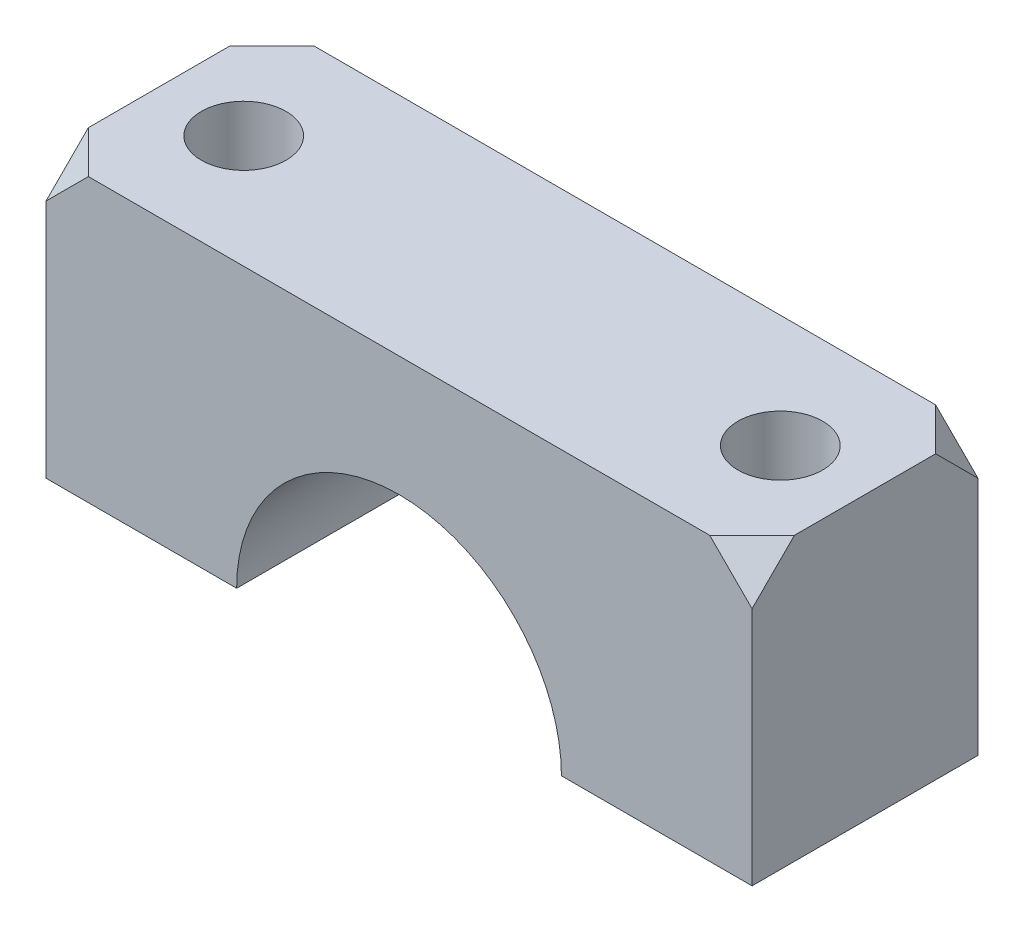
ISO-10303-21;
HEADER;
FILE_DESCRIPTION(('STEP AP214'),'2;1');
FILE_NAME('part.step','',(''),(''),'','','');
FILE_SCHEMA(('AUTOMOTIVE_DESIGN { 1 0 10303 214 1 1 1 1 }'));
ENDSEC;
DATA;
#1=APPLICATION_CONTEXT('core data for automotive mechanical design processes');
#2=APPLICATION_PROTOCOL_DEFINITION('international standard','automotive_design',2000,#1);
#3=PRODUCT_CONTEXT('',#1,'mechanical');
#4=PRODUCT('Part','Part','',(#3));
#5=PRODUCT_RELATED_PRODUCT_CATEGORY('part','',(#4));
#6=PRODUCT_DEFINITION_FORMATION('','',#4);
#7=PRODUCT_DEFINITION_CONTEXT('part definition',#1,'design');
#8=PRODUCT_DEFINITION('design','',#6,#7);
#9=PRODUCT_DEFINITION_SHAPE('','',#8);
#10=(LENGTH_UNIT() NAMED_UNIT(*) SI_UNIT(.MILLI.,.METRE.));
#11=(NAMED_UNIT(*) PLANE_ANGLE_UNIT() SI_UNIT($,.RADIAN.));
#12=(NAMED_UNIT(*) SI_UNIT($,.STERADIAN.) SOLID_ANGLE_UNIT());
#13=UNCERTAINTY_MEASURE_WITH_UNIT(LENGTH_MEASURE(1.E-05),#10,'distance_accuracy_value','');
#14=(GEOMETRIC_REPRESENTATION_CONTEXT(3) GLOBAL_UNCERTAINTY_ASSIGNED_CONTEXT((#13)) GLOBAL_UNIT_ASSIGNED_CONTEXT((#10,
#11,#12)) REPRESENTATION_CONTEXT('',''));
#15=CARTESIAN_POINT('',(0.,0.,0.));
#16=DIRECTION('',(0.,0.,1.));
#17=DIRECTION('',(1.,0.,0.));
#18=AXIS2_PLACEMENT_3D('',#15,#16,#17);
#19=CARTESIAN_POINT('',(0.,20.,19.));
#20=DIRECTION('',(0.,1.,0.));
#21=DIRECTION('',(0.,0.,1.));
#22=AXIS2_PLACEMENT_3D('',#19,#20,#21);
#23=PLANE('',#22);
#24=CARTESIAN_POINT('',(-19.,20.,9.50000000000001));
#25=DIRECTION('',(0.,1.,0.));
#26=DIRECTION('',(0.,0.,1.));
#27=AXIS2_PLACEMENT_3D('',#24,#25,#26);
#28=CIRCLE('',#27,3.);
#29=CARTESIAN_POINT('',(-19.,20.,12.5));
#30=VERTEX_POINT('',#29);
#31=EDGE_CURVE('E201',#30,#30,#28,.T.);
#32=ORIENTED_EDGE('',*,*,#31,.F.);
#33=EDGE_LOOP('',(#32));
#34=FACE_BOUND('',#33,.T.);
#35=CARTESIAN_POINT('',(19.,20.,9.49999999999999));
#36=DIRECTION('',(0.,1.,0.));
#37=DIRECTION('',(0.,0.,1.));
#38=AXIS2_PLACEMENT_3D('',#35,#36,#37);
#39=CIRCLE('',#38,3.);
#40=CARTESIAN_POINT('',(19.,20.,12.5));
#41=VERTEX_POINT('',#40);
#42=EDGE_CURVE('E202',#41,#41,#39,.T.);
#43=ORIENTED_EDGE('',*,*,#42,.F.);
#44=EDGE_LOOP('',(#43));
#45=FACE_BOUND('',#44,.T.);
#46=DIRECTION('',(0.,0.,-1.));
#47=VECTOR('',#46,1.);
#48=CARTESIAN_POINT('',(25.,20.,19.));
#49=LINE('',#48,#47);
#50=CARTESIAN_POINT('',(25.,20.,14.5));
#51=VERTEX_POINT('',#50);
#52=CARTESIAN_POINT('',(25.,20.,4.5));
#53=VERTEX_POINT('',#52);
#54=EDGE_CURVE('E183',#51,#53,#49,.T.);
#55=ORIENTED_EDGE('',*,*,#54,.T.);
#56=DIRECTION('',(-0.707106781186547,0.,-0.707106781186548));
#57=VECTOR('',#56,1.);
#58=CARTESIAN_POINT('',(19.75,20.,-0.749999999999997));
#59=LINE('',#58,#57);
#60=CARTESIAN_POINT('',(22.,20.,1.5));
#61=VERTEX_POINT('',#60);
#62=EDGE_CURVE('E55',#53,#61,#59,.T.);
#63=ORIENTED_EDGE('',*,*,#62,.T.);
#64=DIRECTION('',(1.,0.,0.));
#65=VECTOR('',#64,1.);
#66=CARTESIAN_POINT('',(-25.,20.,1.5));
#67=LINE('',#66,#65);
#68=CARTESIAN_POINT('',(-22.,20.,1.5));
#69=VERTEX_POINT('',#68);
#70=EDGE_CURVE('E132',#69,#61,#67,.T.);
#71=ORIENTED_EDGE('',*,*,#70,.F.);
#72=DIRECTION('',(-0.707106781186547,0.,0.707106781186548));
#73=VECTOR('',#72,1.);
#74=CARTESIAN_POINT('',(-19.75,20.,-0.749999999999994));
#75=LINE('',#74,#73);
#76=CARTESIAN_POINT('',(-25.,20.,4.50000000000001));
#77=VERTEX_POINT('',#76);
#78=EDGE_CURVE('E147',#69,#77,#75,.T.);
#79=ORIENTED_EDGE('',*,*,#78,.T.);
#80=DIRECTION('',(0.,0.,-1.));
#81=VECTOR('',#80,1.);
#82=CARTESIAN_POINT('',(-25.,20.,19.));
#83=LINE('',#82,#81);
#84=CARTESIAN_POINT('',(-25.,20.,14.5));
#85=VERTEX_POINT('',#84);
#86=EDGE_CURVE('E186',#85,#77,#83,.T.);
#87=ORIENTED_EDGE('',*,*,#86,.F.);
#88=DIRECTION('',(0.707106781186547,0.,0.707106781186547));
#89=VECTOR('',#88,1.);
#90=CARTESIAN_POINT('',(-10.25,20.,29.25));
#91=LINE('',#90,#89);
#92=CARTESIAN_POINT('',(-22.,20.,17.5));
#93=VERTEX_POINT('',#92);
#94=EDGE_CURVE('E159',#85,#93,#91,.T.);
#95=ORIENTED_EDGE('',*,*,#94,.T.);
#96=DIRECTION('',(-1.,0.,0.));
#97=VECTOR('',#96,1.);
#98=CARTESIAN_POINT('',(25.,20.,17.5));
#99=LINE('',#98,#97);
#100=CARTESIAN_POINT('',(22.,20.,17.5));
#101=VERTEX_POINT('',#100);
#102=EDGE_CURVE('E234',#101,#93,#99,.T.);
#103=ORIENTED_EDGE('',*,*,#102,.F.);
#104=DIRECTION('',(0.707106781186547,0.,-0.707106781186547));
#105=VECTOR('',#104,1.);
#106=CARTESIAN_POINT('',(10.25,20.,29.25));
#107=LINE('',#106,#105);
#108=EDGE_CURVE('E171',#101,#51,#107,.T.);
#109=ORIENTED_EDGE('',*,*,#108,.T.);
#110=EDGE_LOOP('',(#55,#63,#71,#79,#87,#95,#103,#109));
#111=FACE_BOUND('',#110,.T.);
#112=ADVANCED_FACE('F46',(#34,#45,#111),#23,.T.);
#113=CARTESIAN_POINT('',(0.,0.,1.5));
#114=DIRECTION('',(0.,0.,-1.));
#115=DIRECTION('',(-1.,0.,0.));
#116=AXIS2_PLACEMENT_3D('',#113,#114,#115);
#117=PLANE('',#116);
#118=ORIENTED_EDGE('',*,*,#70,.T.);
#119=DIRECTION('',(0.707106781186548,-0.707106781186548,0.));
#120=VECTOR('',#119,1.);
#121=CARTESIAN_POINT('',(21.,21.,1.5));
#122=LINE('',#121,#120);
#123=CARTESIAN_POINT('',(25.,17.,1.5));
#124=VERTEX_POINT('',#123);
#125=EDGE_CURVE('E135',#61,#124,#122,.T.);
#126=ORIENTED_EDGE('',*,*,#125,.T.);
#127=DIRECTION('',(0.,-1.,0.));
#128=VECTOR('',#127,1.);
#129=CARTESIAN_POINT('',(25.,20.,1.5));
#130=LINE('',#129,#128);
#131=CARTESIAN_POINT('',(25.,0.,1.5));
#132=VERTEX_POINT('',#131);
#133=EDGE_CURVE('E121',#124,#132,#130,.T.);
#134=ORIENTED_EDGE('',*,*,#133,.T.);
#135=DIRECTION('',(-1.,0.,0.));
#136=VECTOR('',#135,1.);
#137=CARTESIAN_POINT('',(25.,0.,1.5));
#138=LINE('',#137,#136);
#139=CARTESIAN_POINT('',(11.5,0.,1.5));
#140=VERTEX_POINT('',#139);
#141=EDGE_CURVE('E131',#132,#140,#138,.T.);
#142=ORIENTED_EDGE('',*,*,#141,.T.);
#143=CARTESIAN_POINT('',(0.,0.,1.5));
#144=DIRECTION('',(0.,0.,1.));
#145=DIRECTION('',(-1.,0.,0.));
#146=AXIS2_PLACEMENT_3D('',#143,#144,#145);
#147=CIRCLE('',#146,11.5);
#148=CARTESIAN_POINT('',(-11.5,0.,1.5));
#149=VERTEX_POINT('',#148);
#150=EDGE_CURVE('E224',#140,#149,#147,.T.);
#151=ORIENTED_EDGE('',*,*,#150,.T.);
#152=DIRECTION('',(-1.,0.,0.));
#153=VECTOR('',#152,1.);
#154=CARTESIAN_POINT('',(-11.5,0.,1.5));
#155=LINE('',#154,#153);
#156=CARTESIAN_POINT('',(-25.,0.,1.5));
#157=VERTEX_POINT('',#156);
#158=EDGE_CURVE('E220',#149,#157,#155,.T.);
#159=ORIENTED_EDGE('',*,*,#158,.T.);
#160=DIRECTION('',(0.,1.,0.));
#161=VECTOR('',#160,1.);
#162=CARTESIAN_POINT('',(-25.,0.,1.5));
#163=LINE('',#162,#161);
#164=CARTESIAN_POINT('',(-25.,17.,1.5));
#165=VERTEX_POINT('',#164);
#166=EDGE_CURVE('E216',#157,#165,#163,.T.);
#167=ORIENTED_EDGE('',*,*,#166,.T.);
#168=DIRECTION('',(0.707106781186548,0.707106781186548,0.));
#169=VECTOR('',#168,1.);
#170=CARTESIAN_POINT('',(-21.,21.,1.5));
#171=LINE('',#170,#169);
#172=EDGE_CURVE('E140',#165,#69,#171,.T.);
#173=ORIENTED_EDGE('',*,*,#172,.T.);
#174=EDGE_LOOP('',(#118,#126,#134,#142,#151,#159,#167,#173));
#175=FACE_BOUND('',#174,.T.);
#176=ADVANCED_FACE('F136',(#175),#117,.T.);
#177=CARTESIAN_POINT('',(-25.,0.,19.));
#178=DIRECTION('',(-1.,0.,0.));
#179=DIRECTION('',(0.,0.,1.));
#180=AXIS2_PLACEMENT_3D('',#177,#178,#179);
#181=PLANE('',#180);
#182=ORIENTED_EDGE('',*,*,#86,.T.);
#183=DIRECTION('',(0.,-0.707106781186547,-0.707106781186548));
#184=VECTOR('',#183,1.);
#185=CARTESIAN_POINT('',(-25.,17.25,1.75000000000001));
#186=LINE('',#185,#184);
#187=EDGE_CURVE('E151',#77,#165,#186,.T.);
#188=ORIENTED_EDGE('',*,*,#187,.T.);
#189=ORIENTED_EDGE('',*,*,#166,.F.);
#190=DIRECTION('',(0.,0.,-1.));
#191=VECTOR('',#190,1.);
#192=CARTESIAN_POINT('',(-25.,0.,19.));
#193=LINE('',#192,#191);
#194=CARTESIAN_POINT('',(-25.,0.,17.5));
#195=VERTEX_POINT('',#194);
#196=EDGE_CURVE('E190',#195,#157,#193,.T.);
#197=ORIENTED_EDGE('',*,*,#196,.F.);
#198=DIRECTION('',(0.,-1.,0.));
#199=VECTOR('',#198,1.);
#200=CARTESIAN_POINT('',(-25.,20.,17.5));
#201=LINE('',#200,#199);
#202=CARTESIAN_POINT('',(-25.,17.,17.5));
#203=VERTEX_POINT('',#202);
#204=EDGE_CURVE('E231',#203,#195,#201,.T.);
#205=ORIENTED_EDGE('',*,*,#204,.F.);
#206=DIRECTION('',(0.,0.707106781186547,-0.707106781186547));
#207=VECTOR('',#206,1.);
#208=CARTESIAN_POINT('',(-25.,7.75,26.75));
#209=LINE('',#208,#207);
#210=EDGE_CURVE('E155',#203,#85,#209,.T.);
#211=ORIENTED_EDGE('',*,*,#210,.T.);
#212=EDGE_LOOP('',(#182,#188,#189,#197,#205,#211));
#213=FACE_BOUND('',#212,.T.);
#214=ADVANCED_FACE('F265',(#213),#181,.T.);
#215=CARTESIAN_POINT('',(0.,0.,17.5));
#216=DIRECTION('',(0.,0.,1.));
#217=DIRECTION('',(1.,0.,0.));
#218=AXIS2_PLACEMENT_3D('',#215,#216,#217);
#219=PLANE('',#218);
#220=ORIENTED_EDGE('',*,*,#102,.T.);
#221=DIRECTION('',(-0.707106781186547,-0.707106781186547,0.));
#222=VECTOR('',#221,1.);
#223=CARTESIAN_POINT('',(-21.,21.,17.5));
#224=LINE('',#223,#222);
#225=EDGE_CURVE('E163',#93,#203,#224,.T.);
#226=ORIENTED_EDGE('',*,*,#225,.T.);
#227=ORIENTED_EDGE('',*,*,#204,.T.);
#228=DIRECTION('',(1.,0.,0.));
#229=VECTOR('',#228,1.);
#230=CARTESIAN_POINT('',(-25.,0.,17.5));
#231=LINE('',#230,#229);
#232=CARTESIAN_POINT('',(-11.5,0.,17.5));
#233=VERTEX_POINT('',#232);
#234=EDGE_CURVE('E228',#195,#233,#231,.T.);
#235=ORIENTED_EDGE('',*,*,#234,.T.);
#236=CARTESIAN_POINT('',(0.,0.,17.5));
#237=DIRECTION('',(0.,0.,-1.));
#238=DIRECTION('',(1.,0.,0.));
#239=AXIS2_PLACEMENT_3D('',#236,#237,#238);
#240=CIRCLE('',#239,11.5);
#241=CARTESIAN_POINT('',(11.5,0.,17.5));
#242=VERTEX_POINT('',#241);
#243=EDGE_CURVE('E245',#233,#242,#240,.T.);
#244=ORIENTED_EDGE('',*,*,#243,.T.);
#245=DIRECTION('',(1.,0.,0.));
#246=VECTOR('',#245,1.);
#247=CARTESIAN_POINT('',(11.5,0.,17.5));
#248=LINE('',#247,#246);
#249=CARTESIAN_POINT('',(25.,0.,17.5));
#250=VERTEX_POINT('',#249);
#251=EDGE_CURVE('E242',#242,#250,#248,.T.);
#252=ORIENTED_EDGE('',*,*,#251,.T.);
#253=DIRECTION('',(0.,1.,0.));
#254=VECTOR('',#253,1.);
#255=CARTESIAN_POINT('',(25.,0.,17.5));
#256=LINE('',#255,#254);
#257=CARTESIAN_POINT('',(25.,17.,17.5));
#258=VERTEX_POINT('',#257);
#259=EDGE_CURVE('E238',#250,#258,#256,.T.);
#260=ORIENTED_EDGE('',*,*,#259,.T.);
#261=DIRECTION('',(-0.707106781186547,0.707106781186547,0.));
#262=VECTOR('',#261,1.);
#263=CARTESIAN_POINT('',(21.,21.,17.5));
#264=LINE('',#263,#262);
#265=EDGE_CURVE('E167',#258,#101,#264,.T.);
#266=ORIENTED_EDGE('',*,*,#265,.T.);
#267=EDGE_LOOP('',(#220,#226,#227,#235,#244,#252,#260,#266));
#268=FACE_BOUND('',#267,.T.);
#269=ADVANCED_FACE('F250',(#268),#219,.T.);
#270=CARTESIAN_POINT('',(0.,0.,19.));
#271=DIRECTION('',(0.,0.,-1.));
#272=DIRECTION('',(-1.,0.,0.));
#273=AXIS2_PLACEMENT_3D('',#270,#271,#272);
#274=CYLINDRICAL_SURFACE('',#273,11.5);
#275=DIRECTION('',(0.,0.,-1.));
#276=VECTOR('',#275,1.);
#277=CARTESIAN_POINT('',(11.5,0.,19.));
#278=LINE('',#277,#276);
#279=EDGE_CURVE('E178',#242,#140,#278,.T.);
#280=ORIENTED_EDGE('',*,*,#279,.F.);
#281=ORIENTED_EDGE('',*,*,#243,.F.);
#282=DIRECTION('',(0.,0.,-1.));
#283=VECTOR('',#282,1.);
#284=CARTESIAN_POINT('',(-11.5,0.,19.));
#285=LINE('',#284,#283);
#286=EDGE_CURVE('E193',#233,#149,#285,.T.);
#287=ORIENTED_EDGE('',*,*,#286,.T.);
#288=ORIENTED_EDGE('',*,*,#150,.F.);
#289=EDGE_LOOP('',(#280,#281,#287,#288));
#290=FACE_BOUND('',#289,.T.);
#291=ADVANCED_FACE('F48',(#290),#274,.F.);
#292=CARTESIAN_POINT('',(0.,0.,19.));
#293=DIRECTION('',(0.,1.,0.));
#294=DIRECTION('',(-1.,0.,0.));
#295=AXIS2_PLACEMENT_3D('',#292,#293,#294);
#296=PLANE('',#295);
#297=CARTESIAN_POINT('',(19.,0.,9.49999999999999));
#298=DIRECTION('',(0.,1.,0.));
#299=DIRECTION('',(0.,0.,1.));
#300=AXIS2_PLACEMENT_3D('',#297,#298,#299);
#301=CIRCLE('',#300,3.);
#302=CARTESIAN_POINT('',(19.,0.,12.5));
#303=VERTEX_POINT('',#302);
#304=EDGE_CURVE('E197',#303,#303,#301,.F.);
#305=ORIENTED_EDGE('',*,*,#304,.F.);
#306=EDGE_LOOP('',(#305));
#307=FACE_BOUND('',#306,.T.);
#308=ORIENTED_EDGE('',*,*,#251,.F.);
#309=ORIENTED_EDGE('',*,*,#279,.T.);
#310=ORIENTED_EDGE('',*,*,#141,.F.);
#311=DIRECTION('',(0.,0.,-1.));
#312=VECTOR('',#311,1.);
#313=CARTESIAN_POINT('',(25.,0.,19.));
#314=LINE('',#313,#312);
#315=EDGE_CURVE('E126',#250,#132,#314,.T.);
#316=ORIENTED_EDGE('',*,*,#315,.F.);
#317=EDGE_LOOP('',(#308,#309,#310,#316));
#318=FACE_BOUND('',#317,.T.);
#319=ADVANCED_FACE('F256',(#307,#318),#296,.F.);
#320=CARTESIAN_POINT('',(25.,0.,19.));
#321=DIRECTION('',(-1.,0.,0.));
#322=DIRECTION('',(0.,0.,1.));
#323=AXIS2_PLACEMENT_3D('',#320,#321,#322);
#324=PLANE('',#323);
#325=DIRECTION('',(0.,-0.707106781186547,-0.707106781186548));
#326=VECTOR('',#325,1.);
#327=CARTESIAN_POINT('',(25.,17.25,1.75000000000001));
#328=LINE('',#327,#326);
#329=EDGE_CURVE('E11',#53,#124,#328,.T.);
#330=ORIENTED_EDGE('',*,*,#329,.F.);
#331=ORIENTED_EDGE('',*,*,#54,.F.);
#332=DIRECTION('',(0.,0.707106781186547,-0.707106781186547));
#333=VECTOR('',#332,1.);
#334=CARTESIAN_POINT('',(25.,7.75,26.75));
#335=LINE('',#334,#333);
#336=EDGE_CURVE('E175',#258,#51,#335,.T.);
#337=ORIENTED_EDGE('',*,*,#336,.F.);
#338=ORIENTED_EDGE('',*,*,#259,.F.);
#339=ORIENTED_EDGE('',*,*,#315,.T.);
#340=ORIENTED_EDGE('',*,*,#133,.F.);
#341=EDGE_LOOP('',(#330,#331,#337,#338,#339,#340));
#342=FACE_BOUND('',#341,.T.);
#343=ADVANCED_FACE('F123',(#342),#324,.F.);
#344=CARTESIAN_POINT('',(0.,0.,19.));
#345=DIRECTION('',(0.,1.,0.));
#346=DIRECTION('',(0.,0.,1.));
#347=AXIS2_PLACEMENT_3D('',#344,#345,#346);
#348=PLANE('',#347);
#349=CARTESIAN_POINT('',(-19.,0.,9.50000000000001));
#350=DIRECTION('',(0.,1.,0.));
#351=DIRECTION('',(0.,0.,1.));
#352=AXIS2_PLACEMENT_3D('',#349,#350,#351);
#353=CIRCLE('',#352,3.);
#354=CARTESIAN_POINT('',(-19.,0.,12.5));
#355=VERTEX_POINT('',#354);
#356=EDGE_CURVE('E196',#355,#355,#353,.F.);
#357=ORIENTED_EDGE('',*,*,#356,.F.);
#358=EDGE_LOOP('',(#357));
#359=FACE_BOUND('',#358,.T.);
#360=ORIENTED_EDGE('',*,*,#234,.F.);
#361=ORIENTED_EDGE('',*,*,#196,.T.);
#362=ORIENTED_EDGE('',*,*,#158,.F.);
#363=ORIENTED_EDGE('',*,*,#286,.F.);
#364=EDGE_LOOP('',(#360,#361,#362,#363));
#365=FACE_BOUND('',#364,.T.);
#366=ADVANCED_FACE('F261',(#359,#365),#348,.F.);
#367=CARTESIAN_POINT('',(-19.,-8.48528137423857,9.50000000000001));
#368=DIRECTION('',(0.,1.,0.));
#369=DIRECTION('',(0.,0.,1.));
#370=AXIS2_PLACEMENT_3D('',#367,#368,#369);
#371=CYLINDRICAL_SURFACE('',#370,3.);
#372=CARTESIAN_POINT('',(-19.,0.,12.5));
#373=CARTESIAN_POINT('',(-19.,0.208333333333332,12.5));
#374=CARTESIAN_POINT('',(-19.,0.416666666666665,12.5));
#375=CARTESIAN_POINT('',(-19.,0.833333333333332,12.5));
#376=CARTESIAN_POINT('',(-19.,1.04166666666667,12.5));
#377=CARTESIAN_POINT('',(-19.,1.45833333333333,12.5));
#378=CARTESIAN_POINT('',(-19.,1.66666666666667,12.5));
#379=CARTESIAN_POINT('',(-19.,2.08333333333333,12.5));
#380=CARTESIAN_POINT('',(-19.,2.29166666666667,12.5));
#381=CARTESIAN_POINT('',(-19.,2.70833333333333,12.5));
#382=CARTESIAN_POINT('',(-19.,2.91666666666667,12.5));
#383=CARTESIAN_POINT('',(-19.,3.33333333333333,12.5));
#384=CARTESIAN_POINT('',(-19.,3.54166666666667,12.5));
#385=CARTESIAN_POINT('',(-19.,3.95833333333333,12.5));
#386=CARTESIAN_POINT('',(-19.,4.16666666666667,12.5));
#387=CARTESIAN_POINT('',(-19.,4.58333333333333,12.5));
#388=CARTESIAN_POINT('',(-19.,4.79166666666667,12.5));
#389=CARTESIAN_POINT('',(-19.,5.20833333333333,12.5));
#390=CARTESIAN_POINT('',(-19.,5.41666666666667,12.5));
#391=CARTESIAN_POINT('',(-19.,5.83333333333333,12.5));
#392=CARTESIAN_POINT('',(-19.,6.04166666666667,12.5));
#393=CARTESIAN_POINT('',(-19.,6.45833333333333,12.5));
#394=CARTESIAN_POINT('',(-19.,6.66666666666667,12.5));
#395=CARTESIAN_POINT('',(-19.,7.08333333333333,12.5));
#396=CARTESIAN_POINT('',(-19.,7.29166666666666,12.5));
#397=CARTESIAN_POINT('',(-19.,7.70833333333333,12.5));
#398=CARTESIAN_POINT('',(-19.,7.91666666666666,12.5));
#399=CARTESIAN_POINT('',(-19.,8.33333333333333,12.5));
#400=CARTESIAN_POINT('',(-19.,8.54166666666666,12.5));
#401=CARTESIAN_POINT('',(-19.,8.95833333333333,12.5));
#402=CARTESIAN_POINT('',(-19.,9.16666666666666,12.5));
#403=CARTESIAN_POINT('',(-19.,9.58333333333333,12.5));
#404=CARTESIAN_POINT('',(-19.,9.79166666666667,12.5));
#405=CARTESIAN_POINT('',(-19.,10.2083333333333,12.5));
#406=CARTESIAN_POINT('',(-19.,10.4166666666667,12.5));
#407=CARTESIAN_POINT('',(-19.,10.8333333333333,12.5));
#408=CARTESIAN_POINT('',(-19.,11.0416666666667,12.5));
#409=CARTESIAN_POINT('',(-19.,11.4583333333333,12.5));
#410=CARTESIAN_POINT('',(-19.,11.6666666666667,12.5));
#411=CARTESIAN_POINT('',(-19.,12.0833333333333,12.5));
#412=CARTESIAN_POINT('',(-19.,12.2916666666667,12.5));
#413=CARTESIAN_POINT('',(-19.,12.7083333333333,12.5));
#414=CARTESIAN_POINT('',(-19.,12.9166666666667,12.5));
#415=CARTESIAN_POINT('',(-19.,13.3333333333333,12.5));
#416=CARTESIAN_POINT('',(-19.,13.5416666666667,12.5));
#417=CARTESIAN_POINT('',(-19.,13.9583333333333,12.5));
#418=CARTESIAN_POINT('',(-19.,14.1666666666667,12.5));
#419=CARTESIAN_POINT('',(-19.,14.5833333333333,12.5));
#420=CARTESIAN_POINT('',(-19.,14.7916666666667,12.5));
#421=CARTESIAN_POINT('',(-19.,15.2083333333333,12.5));
#422=CARTESIAN_POINT('',(-19.,15.4166666666667,12.5));
#423=CARTESIAN_POINT('',(-19.,15.8333333333333,12.5));
#424=CARTESIAN_POINT('',(-19.,16.0416666666667,12.5));
#425=CARTESIAN_POINT('',(-19.,16.4583333333333,12.5));
#426=CARTESIAN_POINT('',(-19.,16.6666666666667,12.5));
#427=CARTESIAN_POINT('',(-19.,17.0833333333333,12.5));
#428=CARTESIAN_POINT('',(-19.,17.2916666666667,12.5));
#429=CARTESIAN_POINT('',(-19.,17.7083333333333,12.5));
#430=CARTESIAN_POINT('',(-19.,17.9166666666667,12.5));
#431=CARTESIAN_POINT('',(-19.,18.3333333333333,12.5));
#432=CARTESIAN_POINT('',(-19.,18.5416666666667,12.5));
#433=CARTESIAN_POINT('',(-19.,18.9583333333333,12.5));
#434=CARTESIAN_POINT('',(-19.,19.1666666666667,12.5));
#435=CARTESIAN_POINT('',(-19.,19.5833333333333,12.5));
#436=CARTESIAN_POINT('',(-19.,19.7916666666667,12.5));
#437=CARTESIAN_POINT('',(-19.,20.,12.5));
#438=B_SPLINE_CURVE_WITH_KNOTS('',3,(#372,#373,#374,#375,#376,#377,#378,#379,#380,#381,#382,
#383,#384,#385,#386,#387,#388,#389,#390,#391,#392,#393,#394,#395,#396,#397,#398,#399,#400,#401,
#402,#403,#404,#405,#406,#407,#408,#409,#410,#411,#412,#413,#414,#415,#416,#417,#418,#419,#420,
#421,#422,#423,#424,#425,#426,#427,#428,#429,#430,#431,#432,#433,#434,#435,#436,#437),
.UNSPECIFIED.,.F.,.F.,(4,2,2,2,2,2,2,2,2,2,2,2,2,2,2,2,2,2,2,2,2,2,2,2,2,2,2,2,2,2,2,2,4),(0.,
0.625000000000001,1.25,1.875,2.5,3.125,3.75,4.375,5.,5.625,6.25,6.875,7.5,8.125,8.75,9.375,10.,
10.625,11.25,11.875,12.5,13.125,13.75,14.375,15.,15.625,16.25,16.875,17.5,18.125,18.75,19.375,
20.),.UNSPECIFIED.);
#439=EDGE_CURVE('BSEAM285',#355,#30,#438,.T.);
#440=ORIENTED_EDGE('',*,*,#356,.T.);
#441=ORIENTED_EDGE('',*,*,#31,.T.);
#442=ORIENTED_EDGE('',*,*,#439,.T.);
#443=ORIENTED_EDGE('',*,*,#439,.F.);
#444=EDGE_LOOP('',(#440,#442,#441,#443));
#445=FACE_BOUND('',#444,.T.);
#446=ADVANCED_FACE('F285',(#445),#371,.F.);
#447=CARTESIAN_POINT('',(19.,-8.48528137423857,9.49999999999999));
#448=DIRECTION('',(0.,1.,0.));
#449=DIRECTION('',(0.,0.,1.));
#450=AXIS2_PLACEMENT_3D('',#447,#448,#449);
#451=CYLINDRICAL_SURFACE('',#450,3.);
#452=CARTESIAN_POINT('',(19.,0.,12.5));
#453=CARTESIAN_POINT('',(19.,0.208333333333332,12.5));
#454=CARTESIAN_POINT('',(19.,0.416666666666665,12.5));
#455=CARTESIAN_POINT('',(19.,0.833333333333332,12.5));
#456=CARTESIAN_POINT('',(19.,1.04166666666667,12.5));
#457=CARTESIAN_POINT('',(19.,1.45833333333333,12.5));
#458=CARTESIAN_POINT('',(19.,1.66666666666667,12.5));
#459=CARTESIAN_POINT('',(19.,2.08333333333333,12.5));
#460=CARTESIAN_POINT('',(19.,2.29166666666667,12.5));
#461=CARTESIAN_POINT('',(19.,2.70833333333333,12.5));
#462=CARTESIAN_POINT('',(19.,2.91666666666667,12.5));
#463=CARTESIAN_POINT('',(19.,3.33333333333333,12.5));
#464=CARTESIAN_POINT('',(19.,3.54166666666667,12.5));
#465=CARTESIAN_POINT('',(19.,3.95833333333333,12.5));
#466=CARTESIAN_POINT('',(19.,4.16666666666667,12.5));
#467=CARTESIAN_POINT('',(19.,4.58333333333333,12.5));
#468=CARTESIAN_POINT('',(19.,4.79166666666667,12.5));
#469=CARTESIAN_POINT('',(19.,5.20833333333333,12.5));
#470=CARTESIAN_POINT('',(19.,5.41666666666667,12.5));
#471=CARTESIAN_POINT('',(19.,5.83333333333333,12.5));
#472=CARTESIAN_POINT('',(19.,6.04166666666667,12.5));
#473=CARTESIAN_POINT('',(19.,6.45833333333333,12.5));
#474=CARTESIAN_POINT('',(19.,6.66666666666667,12.5));
#475=CARTESIAN_POINT('',(19.,7.08333333333333,12.5));
#476=CARTESIAN_POINT('',(19.,7.29166666666666,12.5));
#477=CARTESIAN_POINT('',(19.,7.70833333333333,12.5));
#478=CARTESIAN_POINT('',(19.,7.91666666666666,12.5));
#479=CARTESIAN_POINT('',(19.,8.33333333333333,12.5));
#480=CARTESIAN_POINT('',(19.,8.54166666666666,12.5));
#481=CARTESIAN_POINT('',(19.,8.95833333333333,12.5));
#482=CARTESIAN_POINT('',(19.,9.16666666666666,12.5));
#483=CARTESIAN_POINT('',(19.,9.58333333333333,12.5));
#484=CARTESIAN_POINT('',(19.,9.79166666666667,12.5));
#485=CARTESIAN_POINT('',(19.,10.2083333333333,12.5));
#486=CARTESIAN_POINT('',(19.,10.4166666666667,12.5));
#487=CARTESIAN_POINT('',(19.,10.8333333333333,12.5));
#488=CARTESIAN_POINT('',(19.,11.0416666666667,12.5));
#489=CARTESIAN_POINT('',(19.,11.4583333333333,12.5));
#490=CARTESIAN_POINT('',(19.,11.6666666666667,12.5));
#491=CARTESIAN_POINT('',(19.,12.0833333333333,12.5));
#492=CARTESIAN_POINT('',(19.,12.2916666666667,12.5));
#493=CARTESIAN_POINT('',(19.,12.7083333333333,12.5));
#494=CARTESIAN_POINT('',(19.,12.9166666666667,12.5));
#495=CARTESIAN_POINT('',(19.,13.3333333333333,12.5));
#496=CARTESIAN_POINT('',(19.,13.5416666666667,12.5));
#497=CARTESIAN_POINT('',(19.,13.9583333333333,12.5));
#498=CARTESIAN_POINT('',(19.,14.1666666666667,12.5));
#499=CARTESIAN_POINT('',(19.,14.5833333333333,12.5));
#500=CARTESIAN_POINT('',(19.,14.7916666666667,12.5));
#501=CARTESIAN_POINT('',(19.,15.2083333333333,12.5));
#502=CARTESIAN_POINT('',(19.,15.4166666666667,12.5));
#503=CARTESIAN_POINT('',(19.,15.8333333333333,12.5));
#504=CARTESIAN_POINT('',(19.,16.0416666666667,12.5));
#505=CARTESIAN_POINT('',(19.,16.4583333333333,12.5));
#506=CARTESIAN_POINT('',(19.,16.6666666666667,12.5));
#507=CARTESIAN_POINT('',(19.,17.0833333333333,12.5));
#508=CARTESIAN_POINT('',(19.,17.2916666666667,12.5));
#509=CARTESIAN_POINT('',(19.,17.7083333333333,12.5));
#510=CARTESIAN_POINT('',(19.,17.9166666666667,12.5));
#511=CARTESIAN_POINT('',(19.,18.3333333333333,12.5));
#512=CARTESIAN_POINT('',(19.,18.5416666666667,12.5));
#513=CARTESIAN_POINT('',(19.,18.9583333333333,12.5));
#514=CARTESIAN_POINT('',(19.,19.1666666666667,12.5));
#515=CARTESIAN_POINT('',(19.,19.5833333333333,12.5));
#516=CARTESIAN_POINT('',(19.,19.7916666666667,12.5));
#517=CARTESIAN_POINT('',(19.,20.,12.5));
#518=B_SPLINE_CURVE_WITH_KNOTS('',3,(#452,#453,#454,#455,#456,#457,#458,#459,#460,#461,#462,
#463,#464,#465,#466,#467,#468,#469,#470,#471,#472,#473,#474,#475,#476,#477,#478,#479,#480,#481,
#482,#483,#484,#485,#486,#487,#488,#489,#490,#491,#492,#493,#494,#495,#496,#497,#498,#499,#500,
#501,#502,#503,#504,#505,#506,#507,#508,#509,#510,#511,#512,#513,#514,#515,#516,#517),
.UNSPECIFIED.,.F.,.F.,(4,2,2,2,2,2,2,2,2,2,2,2,2,2,2,2,2,2,2,2,2,2,2,2,2,2,2,2,2,2,2,2,4),(0.,
0.625000000000001,1.25,1.875,2.5,3.125,3.75,4.375,5.,5.625,6.25,6.875,7.5,8.125,8.75,9.375,10.,
10.625,11.25,11.875,12.5,13.125,13.75,14.375,15.,15.625,16.25,16.875,17.5,18.125,18.75,19.375,
20.),.UNSPECIFIED.);
#519=EDGE_CURVE('BSEAM275',#303,#41,#518,.T.);
#520=ORIENTED_EDGE('',*,*,#304,.T.);
#521=ORIENTED_EDGE('',*,*,#42,.T.);
#522=ORIENTED_EDGE('',*,*,#519,.T.);
#523=ORIENTED_EDGE('',*,*,#519,.F.);
#524=EDGE_LOOP('',(#520,#522,#521,#523));
#525=FACE_BOUND('',#524,.T.);
#526=ADVANCED_FACE('F275',(#525),#451,.F.);
#527=CARTESIAN_POINT('',(19.8333333333333,19.8333333333333,19.8333333333333));
#528=DIRECTION('',(0.577350269189626,0.577350269189626,0.577350269189626));
#529=DIRECTION('',(0.707106781186547,0.,-0.707106781186547));
#530=AXIS2_PLACEMENT_3D('',#527,#528,#529);
#531=PLANE('',#530);
#532=ORIENTED_EDGE('',*,*,#265,.F.);
#533=ORIENTED_EDGE('',*,*,#336,.T.);
#534=ORIENTED_EDGE('',*,*,#108,.F.);
#535=EDGE_LOOP('',(#532,#533,#534));
#536=FACE_BOUND('',#535,.T.);
#537=ADVANCED_FACE('F273',(#536),#531,.T.);
#538=CARTESIAN_POINT('',(-19.8333333333333,19.8333333333333,19.8333333333333));
#539=DIRECTION('',(-0.577350269189626,0.577350269189626,0.577350269189626));
#540=DIRECTION('',(0.707106781186547,0.,0.707106781186547));
#541=AXIS2_PLACEMENT_3D('',#538,#539,#540);
#542=PLANE('',#541);
#543=ORIENTED_EDGE('',*,*,#225,.F.);
#544=ORIENTED_EDGE('',*,*,#94,.F.);
#545=ORIENTED_EDGE('',*,*,#210,.F.);
#546=EDGE_LOOP('',(#543,#544,#545));
#547=FACE_BOUND('',#546,.T.);
#548=ADVANCED_FACE('F269',(#547),#542,.T.);
#549=CARTESIAN_POINT('',(-13.5,13.5,-13.5));
#550=DIRECTION('',(-0.577350269189626,0.577350269189626,-0.577350269189626));
#551=DIRECTION('',(-0.707106781186548,-0.707106781186548,0.));
#552=AXIS2_PLACEMENT_3D('',#549,#550,#551);
#553=PLANE('',#552);
#554=ORIENTED_EDGE('',*,*,#187,.F.);
#555=ORIENTED_EDGE('',*,*,#78,.F.);
#556=ORIENTED_EDGE('',*,*,#172,.F.);
#557=EDGE_LOOP('',(#554,#555,#556));
#558=FACE_BOUND('',#557,.T.);
#559=ADVANCED_FACE('F282',(#558),#553,.T.);
#560=CARTESIAN_POINT('',(13.5,13.5,-13.5));
#561=DIRECTION('',(0.577350269189626,0.577350269189626,-0.577350269189626));
#562=DIRECTION('',(-0.707106781186548,0.707106781186548,0.));
#563=AXIS2_PLACEMENT_3D('',#560,#561,#562);
#564=PLANE('',#563);
#565=ORIENTED_EDGE('',*,*,#125,.F.);
#566=ORIENTED_EDGE('',*,*,#62,.F.);
#567=ORIENTED_EDGE('',*,*,#329,.T.);
#568=EDGE_LOOP('',(#565,#566,#567));
#569=FACE_BOUND('',#568,.T.);
#570=ADVANCED_FACE('F142',(#569),#564,.T.);
#571=CLOSED_SHELL('',(#112,#176,#214,#269,#291,#319,#343,#366,#446,#526,#537,#548,#559,#570));
#572=MANIFOLD_SOLID_BREP('B2',#571);
#573=ADVANCED_BREP_SHAPE_REPRESENTATION('',(#18,#572),#14);
#574=SHAPE_DEFINITION_REPRESENTATION(#9,#573);
ENDSEC;
END-ISO-10303-21;
